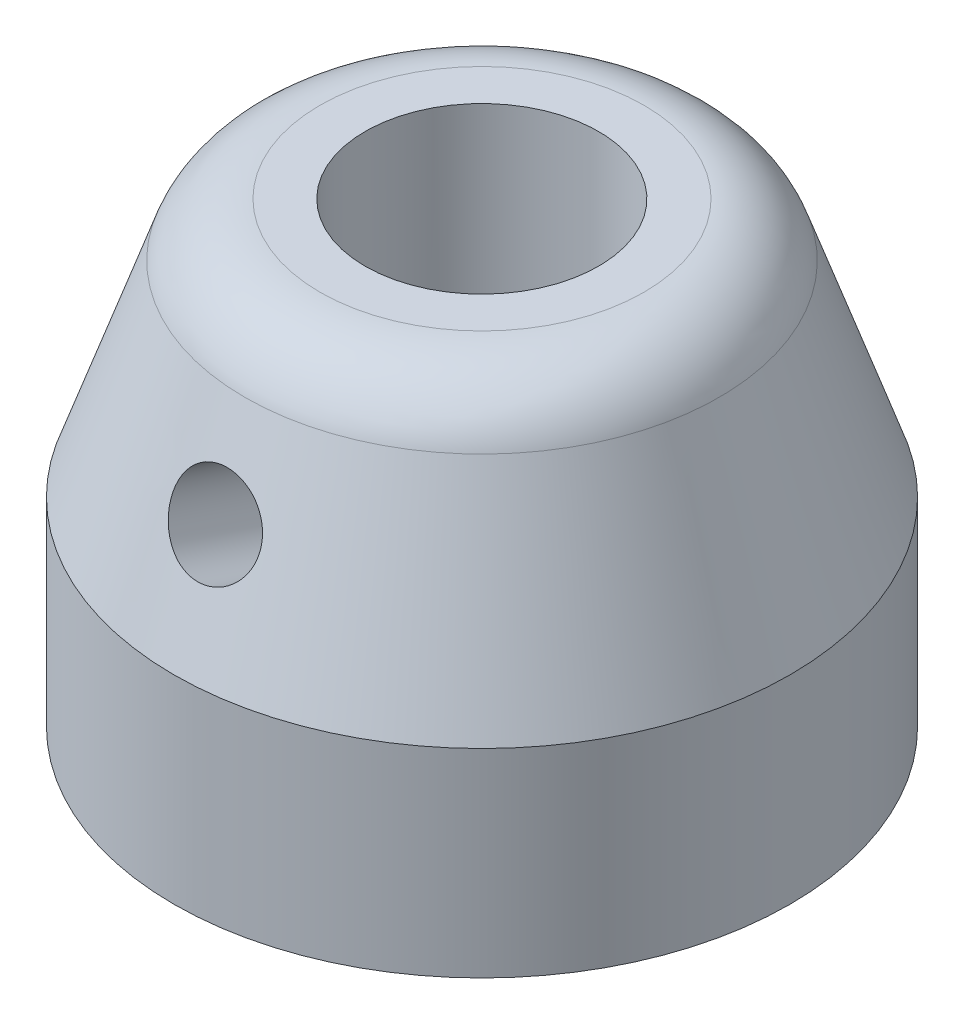
ISO-10303-21;
HEADER;
FILE_DESCRIPTION(('STEP AP214'),'2;1');
FILE_NAME('part.step','',(''),(''),'','','');
FILE_SCHEMA(('AUTOMOTIVE_DESIGN { 1 0 10303 214 1 1 1 1 }'));
ENDSEC;
DATA;
#1=APPLICATION_CONTEXT('core data for automotive mechanical design processes');
#2=APPLICATION_PROTOCOL_DEFINITION('international standard','automotive_design',2000,#1);
#3=PRODUCT_CONTEXT('',#1,'mechanical');
#4=PRODUCT('Part','Part','',(#3));
#5=PRODUCT_RELATED_PRODUCT_CATEGORY('part','',(#4));
#6=PRODUCT_DEFINITION_FORMATION('','',#4);
#7=PRODUCT_DEFINITION_CONTEXT('part definition',#1,'design');
#8=PRODUCT_DEFINITION('design','',#6,#7);
#9=PRODUCT_DEFINITION_SHAPE('','',#8);
#10=(LENGTH_UNIT() NAMED_UNIT(*) SI_UNIT(.MILLI.,.METRE.));
#11=(NAMED_UNIT(*) PLANE_ANGLE_UNIT() SI_UNIT($,.RADIAN.));
#12=(NAMED_UNIT(*) SI_UNIT($,.STERADIAN.) SOLID_ANGLE_UNIT());
#13=UNCERTAINTY_MEASURE_WITH_UNIT(LENGTH_MEASURE(1.E-05),#10,'distance_accuracy_value','');
#14=(GEOMETRIC_REPRESENTATION_CONTEXT(3) GLOBAL_UNCERTAINTY_ASSIGNED_CONTEXT((#13)) GLOBAL_UNIT_ASSIGNED_CONTEXT((#10,
#11,#12)) REPRESENTATION_CONTEXT('',''));
#15=CARTESIAN_POINT('',(0.,0.,0.));
#16=DIRECTION('',(0.,0.,1.));
#17=DIRECTION('',(1.,0.,0.));
#18=AXIS2_PLACEMENT_3D('',#15,#16,#17);
#19=CARTESIAN_POINT('',(0.000913764013984629,46.,0.0159483627720887));
#20=DIRECTION('',(0.,1.,0.));
#21=DIRECTION('',(0.,0.,1.));
#22=AXIS2_PLACEMENT_3D('',#19,#20,#21);
#23=CYLINDRICAL_SURFACE('',#22,11.75);
#24=CARTESIAN_POINT('',(0.000913764013984629,46.,0.0159483627720887));
#25=DIRECTION('',(0.,1.,0.));
#26=DIRECTION('',(0.,0.,1.));
#27=AXIS2_PLACEMENT_3D('',#24,#25,#26);
#28=CIRCLE('',#27,11.75);
#29=CARTESIAN_POINT('',(0.000913764013984629,46.,11.7659483627721));
#30=VERTEX_POINT('',#29);
#31=EDGE_CURVE('E74',#30,#30,#28,.T.);
#32=ORIENTED_EDGE('',*,*,#31,.T.);
#33=EDGE_LOOP('',(#32));
#34=FACE_BOUND('',#33,.T.);
#35=CARTESIAN_POINT('',(0.000913764013984629,2.,0.0159483627720887));
#36=DIRECTION('',(0.,-1.,0.));
#37=DIRECTION('',(0.,0.,-1.));
#38=AXIS2_PLACEMENT_3D('',#35,#36,#37);
#39=CIRCLE('',#38,11.75);
#40=CARTESIAN_POINT('',(0.000913764013984629,2.,-11.7340516372279));
#41=VERTEX_POINT('',#40);
#42=EDGE_CURVE('E54',#41,#41,#39,.F.);
#43=ORIENTED_EDGE('',*,*,#42,.F.);
#44=EDGE_LOOP('',(#43));
#45=FACE_BOUND('',#44,.T.);
#46=ADVANCED_FACE('F51',(#34,#45),#23,.F.);
#47=CARTESIAN_POINT('',(22.,46.,0.));
#48=DIRECTION('',(0.,-1.,0.));
#49=DIRECTION('',(0.,0.,-1.));
#50=AXIS2_PLACEMENT_3D('',#47,#48,#49);
#51=PLANE('',#50);
#52=CARTESIAN_POINT('',(0.,46.,0.));
#53=DIRECTION('',(0.,-1.,0.));
#54=DIRECTION('',(0.,0.,-1.));
#55=AXIS2_PLACEMENT_3D('',#52,#53,#54);
#56=CIRCLE('',#55,16.303497543263);
#57=CARTESIAN_POINT('',(0.,46.,-16.303497543263));
#58=VERTEX_POINT('',#57);
#59=EDGE_CURVE('E91',#58,#58,#56,.F.);
#60=ORIENTED_EDGE('',*,*,#59,.T.);
#61=EDGE_LOOP('',(#60));
#62=FACE_BOUND('',#61,.T.);
#63=ORIENTED_EDGE('',*,*,#31,.F.);
#64=EDGE_LOOP('',(#63));
#65=FACE_BOUND('',#64,.T.);
#66=ADVANCED_FACE('F114',(#62,#65),#51,.F.);
#67=CARTESIAN_POINT('',(0.,0.,0.));
#68=DIRECTION('',(0.,1.,0.));
#69=DIRECTION('',(0.,0.,1.));
#70=AXIS2_PLACEMENT_3D('',#67,#68,#69);
#71=PLANE('',#70);
#72=CARTESIAN_POINT('',(0.,0.,0.));
#73=DIRECTION('',(0.,-1.,0.));
#74=DIRECTION('',(0.,0.,-1.));
#75=AXIS2_PLACEMENT_3D('',#72,#73,#74);
#76=CIRCLE('',#75,18.2033523408867);
#77=CARTESIAN_POINT('',(0.,0.,18.2033523408867));
#78=VERTEX_POINT('',#77);
#79=EDGE_CURVE('E140',#78,#78,#76,.T.);
#80=ORIENTED_EDGE('',*,*,#79,.F.);
#81=EDGE_LOOP('',(#80));
#82=FACE_BOUND('',#81,.T.);
#83=CARTESIAN_POINT('',(0.,0.,0.));
#84=DIRECTION('',(0.,1.,0.));
#85=DIRECTION('',(0.,0.,1.));
#86=AXIS2_PLACEMENT_3D('',#83,#84,#85);
#87=CIRCLE('',#86,31.);
#88=CARTESIAN_POINT('',(0.,0.,31.));
#89=VERTEX_POINT('',#88);
#90=EDGE_CURVE('E90',#89,#89,#87,.T.);
#91=ORIENTED_EDGE('',*,*,#90,.F.);
#92=EDGE_LOOP('',(#91));
#93=FACE_BOUND('',#92,.T.);
#94=ADVANCED_FACE('F118',(#82,#93),#71,.F.);
#95=CARTESIAN_POINT('',(0.,46.,0.));
#96=DIRECTION('',(0.,1.,0.));
#97=DIRECTION('',(0.,0.,1.));
#98=AXIS2_PLACEMENT_3D('',#95,#96,#97);
#99=CYLINDRICAL_SURFACE('',#98,31.);
#100=CARTESIAN_POINT('',(0.,20.,0.));
#101=DIRECTION('',(0.,1.,0.));
#102=DIRECTION('',(0.,0.,1.));
#103=AXIS2_PLACEMENT_3D('',#100,#101,#102);
#104=CIRCLE('',#103,31.);
#105=CARTESIAN_POINT('',(0.,20.,31.));
#106=VERTEX_POINT('',#105);
#107=EDGE_CURVE('E78',#106,#106,#104,.T.);
#108=ORIENTED_EDGE('',*,*,#107,.F.);
#109=EDGE_LOOP('',(#108));
#110=FACE_BOUND('',#109,.T.);
#111=ORIENTED_EDGE('',*,*,#90,.T.);
#112=EDGE_LOOP('',(#111));
#113=FACE_BOUND('',#112,.T.);
#114=ADVANCED_FACE('F141',(#110,#113),#99,.T.);
#115=CARTESIAN_POINT('',(0.,20.,0.));
#116=DIRECTION('',(0.,-1.,0.));
#117=DIRECTION('',(0.,0.,-1.));
#118=AXIS2_PLACEMENT_3D('',#115,#116,#117);
#119=CONICAL_SURFACE('',#118,31.,0.333244301111673);
#120=CARTESIAN_POINT('',(-2.46260693911556,27.5747618757833,28.2709140382285));
#121=CARTESIAN_POINT('',(-2.67471313879416,27.700064366315,28.2088981514728));
#122=CARTESIAN_POINT('',(-2.8751199077155,27.8418948550959,28.139653644654));
#123=CARTESIAN_POINT('',(-3.24682694839401,28.155088235638,27.990062379626));
#124=CARTESIAN_POINT('',(-3.4180970015078,28.3264814213967,27.9097042497804));
#125=CARTESIAN_POINT('',(-3.72654761481929,28.6944417214186,27.741689719676));
#126=CARTESIAN_POINT('',(-3.86373834693527,28.8910012974659,27.6540355075891));
#127=CARTESIAN_POINT('',(-4.10012357196919,29.3043181836931,27.4753341055506));
#128=CARTESIAN_POINT('',(-4.19932748188148,29.5210704714803,27.3842877626627));
#129=CARTESIAN_POINT('',(-4.35658939534579,29.968392380982,27.2029071214093));
#130=CARTESIAN_POINT('',(-4.41478192090338,30.1989141125222,27.112571465285));
#131=CARTESIAN_POINT('',(-4.48875790743902,30.6681113095542,26.9357835107167));
#132=CARTESIAN_POINT('',(-4.50454315351322,30.9067864314081,26.8493310489639));
#133=CARTESIAN_POINT('',(-4.49326402326904,31.3828950296487,26.6841084748828));
#134=CARTESIAN_POINT('',(-4.46665801748936,31.6203143119496,26.6052658280715));
#135=CARTESIAN_POINT('',(-4.37225783692611,32.0896264064344,26.4562976625441));
#136=CARTESIAN_POINT('',(-4.30446402777988,32.3215192676592,26.3861720664506));
#137=CARTESIAN_POINT('',(-4.12982781060827,32.772718411518,26.2559739203233));
#138=CARTESIAN_POINT('',(-4.0230353740883,32.9920403878019,26.19588864794));
#139=CARTESIAN_POINT('',(-3.7734636081791,33.412018955146,26.0861187411154));
#140=CARTESIAN_POINT('',(-3.63068169787145,33.612674206143,26.0364348530582));
#141=CARTESIAN_POINT('',(-3.31137390327955,33.9914268328633,25.9468126045675));
#142=CARTESIAN_POINT('',(-3.13450160066254,34.1692583735251,25.9069848103832));
#143=CARTESIAN_POINT('',(-2.75289531122723,34.4943397417704,25.8371463270958));
#144=CARTESIAN_POINT('',(-2.54816014879518,34.641588278307,25.807136052404));
#145=CARTESIAN_POINT('',(-2.115164419278,34.9015547291696,25.755947118353));
#146=CARTESIAN_POINT('',(-1.88677389596488,35.01406673348,25.7348208638967));
#147=CARTESIAN_POINT('',(-1.41389232954915,35.199560443427,25.700821490246));
#148=CARTESIAN_POINT('',(-1.16940242896433,35.2725449508113,25.6879477860909));
#149=CARTESIAN_POINT('',(-0.673635307918935,35.3759199013376,25.6699091230474));
#150=CARTESIAN_POINT('',(-0.422440558884937,35.4066935964754,25.6646747745649));
#151=CARTESIAN_POINT('',(0.0815952279693506,35.4257774696568,25.6614150523405));
#152=CARTESIAN_POINT('',(0.334436163147,35.4140902703759,25.6633892333506));
#153=CARTESIAN_POINT('',(0.832068477561531,35.3489961718621,25.6745991400029));
#154=CARTESIAN_POINT('',(1.0769134141751,35.295985445984,25.683765914866));
#155=CARTESIAN_POINT('',(1.55418468328266,35.1505804371211,25.7097325379822));
#156=CARTESIAN_POINT('',(1.78661051203543,35.0581845579667,25.7265326955967));
#157=CARTESIAN_POINT('',(2.23394504066277,34.83647265403,25.7685999346819));
#158=CARTESIAN_POINT('',(2.44874677282514,34.7069499539074,25.7939145546905));
#159=CARTESIAN_POINT('',(2.85354577840605,34.4153649422243,25.8538238887858));
#160=CARTESIAN_POINT('',(3.04354114409894,34.2533001304528,25.8884193159859));
#161=CARTESIAN_POINT('',(3.39562901242977,33.89957423256,25.9680993309045));
#162=CARTESIAN_POINT('',(3.55737219531522,33.7075915725182,26.0133009619365));
#163=CARTESIAN_POINT('',(3.84566752768857,33.3013099227777,26.1144080227888));
#164=CARTESIAN_POINT('',(3.97222006536443,33.0870111792835,26.1703133345254));
#165=CARTESIAN_POINT('',(4.1863374358716,32.6428047903131,26.2926294149973));
#166=CARTESIAN_POINT('',(4.273943587397,32.4129139866211,26.3590289483861));
#167=CARTESIAN_POINT('',(4.40770820599501,31.9442368697026,26.5014690046821));
#168=CARTESIAN_POINT('',(4.453869947519,31.705451260792,26.5775087653898));
#169=CARTESIAN_POINT('',(4.50304708252596,31.2288209614074,26.7365460278539));
#170=CARTESIAN_POINT('',(4.50654773870063,30.9909965122057,26.8194544544453));
#171=CARTESIAN_POINT('',(4.47156672480509,30.5203591055777,26.9904550090351));
#172=CARTESIAN_POINT('',(4.43308575443905,30.2875460646927,27.0785470506154));
#173=CARTESIAN_POINT('',(4.31550938572783,29.8340253732151,27.2564855664813));
#174=CARTESIAN_POINT('',(4.23654161671231,29.6132820799327,27.346325679072));
#175=CARTESIAN_POINT('',(4.04037462809405,29.1888338181478,27.5245006592055));
#176=CARTESIAN_POINT('',(3.92317311106357,28.9851298744471,27.6128354359585));
#177=CARTESIAN_POINT('',(3.6525557664653,28.5980022407025,27.7851004721415));
#178=CARTESIAN_POINT('',(3.498807758568,28.4147886895107,27.8689811450507));
#179=CARTESIAN_POINT('',(3.15997532538909,28.0753877144621,28.0276586185955));
#180=CARTESIAN_POINT('',(2.97488932254718,27.9192016519749,28.1024549615986));
#181=CARTESIAN_POINT('',(2.57697256340036,27.6366303508456,28.2399604168169));
#182=CARTESIAN_POINT('',(2.3639463102328,27.5104746033418,28.3025758182732));
#183=CARTESIAN_POINT('',(1.91718805982549,27.2926594688135,28.4119096342992));
#184=CARTESIAN_POINT('',(1.68345734678564,27.2009979441234,28.458629033954));
#185=CARTESIAN_POINT('',(1.20315007594064,27.0549112315702,28.5335778925606));
#186=CARTESIAN_POINT('',(0.956645143294292,27.0002984461995,28.5619004729027));
#187=CARTESIAN_POINT('',(0.456724574508723,26.9290017931295,28.5989477242252));
#188=CARTESIAN_POINT('',(0.203308064584291,26.9123227438473,28.607669905523));
#189=CARTESIAN_POINT('',(-0.300733565325077,26.9173225969799,28.6050622564529));
#190=CARTESIAN_POINT('',(-0.551363287712436,26.9386577714617,28.5939121131327));
#191=CARTESIAN_POINT('',(-1.04484420914491,27.0184558930623,28.5524911062392));
#192=CARTESIAN_POINT('',(-1.28770246371461,27.0768840983569,28.5222381347703));
#193=CARTESIAN_POINT('',(-1.68834746573237,27.2064212013683,28.4559150333033));
#194=CARTESIAN_POINT('',(-1.84986370974509,27.2685189012979,28.4242869370323));
#195=CARTESIAN_POINT('',(-2.16365395981802,27.4093636102759,28.3532295654693));
#196=CARTESIAN_POINT('',(-2.31592791059174,27.4881107189068,28.313800243517));
#197=CARTESIAN_POINT('',(-2.46260693911556,27.5747618757833,28.2709140382285));
#198=B_SPLINE_CURVE_WITH_KNOTS('',3,(#120,#121,#122,#123,#124,#125,#126,#127,#128,#129,#130,
#131,#132,#133,#134,#135,#136,#137,#138,#139,#140,#141,#142,#143,#144,#145,#146,#147,#148,#149,
#150,#151,#152,#153,#154,#155,#156,#157,#158,#159,#160,#161,#162,#163,#164,#165,#166,#167,#168,
#169,#170,#171,#172,#173,#174,#175,#176,#177,#178,#179,#180,#181,#182,#183,#184,#185,#186,#187,
#188,#189,#190,#191,#192,#193,#194,#195,#196,#197),.UNSPECIFIED.,.T.,.F.,(4,2,2,2,2,2,2,2,2,2,2,
2,2,2,2,2,2,2,2,2,2,2,2,2,2,2,2,2,2,2,2,2,2,2,2,2,2,2,4),(0.,0.761478533373101,1.52374206908933,
2.28577781199907,3.04762452253207,3.80696050970644,4.56626453281679,5.31741387391342,
6.06855654691372,6.81874008940666,7.56897744523578,8.32728403137302,9.08562262255964,
9.84837378467346,10.6110708751584,11.3667961869343,12.1224748207381,12.8709964629822,
13.61954844359,14.3723511524081,15.1252117212189,15.8868073544659,16.6483945862189,
17.4091719013244,18.169889103435,18.921945089821,19.6739885419459,20.4236757202706,
21.1734079548495,21.9302344537693,22.6870990628048,23.4495741867771,24.2120020510865,
24.9705399306456,25.7291741557853,26.4809835160322,27.2320897584457,27.7586762685043,
28.2852659282415),.UNSPECIFIED.);
#199=CARTESIAN_POINT('',(-2.46260693911556,27.5747618757833,28.2709140382285));
#200=VERTEX_POINT('',#199);
#201=EDGE_CURVE('E11',#200,#200,#198,.T.);
#202=ORIENTED_EDGE('',*,*,#201,.T.);
#203=EDGE_LOOP('',(#202));
#204=FACE_BOUND('',#203,.T.);
#205=CARTESIAN_POINT('',(0.,40.6168845110653,0.));
#206=DIRECTION('',(0.,1.,0.));
#207=DIRECTION('',(0.,0.,1.));
#208=AXIS2_PLACEMENT_3D('',#205,#206,#207);
#209=CIRCLE('',#208,23.8633861307851);
#210=CARTESIAN_POINT('',(0.,40.6168845110653,23.8633861307851));
#211=VERTEX_POINT('',#210);
#212=EDGE_CURVE('E58',#211,#211,#209,.F.);
#213=ORIENTED_EDGE('',*,*,#212,.T.);
#214=EDGE_LOOP('',(#213));
#215=FACE_BOUND('',#214,.T.);
#216=ORIENTED_EDGE('',*,*,#107,.T.);
#217=EDGE_LOOP('',(#216));
#218=FACE_BOUND('',#217,.T.);
#219=ADVANCED_FACE('F102',(#204,#215,#218),#119,.T.);
#220=CARTESIAN_POINT('',(0.,38.,0.));
#221=DIRECTION('',(0.,-1.,0.));
#222=DIRECTION('',(0.,0.,-1.));
#223=AXIS2_PLACEMENT_3D('',#220,#221,#222);
#224=TOROIDAL_SURFACE('',#223,16.303497543263,8.);
#225=ORIENTED_EDGE('',*,*,#212,.F.);
#226=EDGE_LOOP('',(#225));
#227=FACE_BOUND('',#226,.T.);
#228=ORIENTED_EDGE('',*,*,#59,.F.);
#229=EDGE_LOOP('',(#228));
#230=FACE_BOUND('',#229,.T.);
#231=ADVANCED_FACE('F52',(#227,#230),#224,.T.);
#232=CARTESIAN_POINT('',(0.,31.1670237766628,27.1344917696168));
#233=DIRECTION('',(0.,0.327110563883166,0.944986073440258));
#234=DIRECTION('',(0.,-0.944986073440258,0.327110563883166));
#235=AXIS2_PLACEMENT_3D('',#232,#233,#234);
#236=CYLINDRICAL_SURFACE('',#235,4.49999999999999);
#237=CARTESIAN_POINT('',(0.,27.8959181378311,17.6846310352142));
#238=DIRECTION('',(0.,0.327110563883166,0.944986073440258));
#239=DIRECTION('',(0.,-0.944986073440258,0.327110563883166));
#240=AXIS2_PLACEMENT_3D('',#237,#238,#239);
#241=CIRCLE('',#240,4.5);
#242=CARTESIAN_POINT('',(0.,23.6434808073499,19.1566285726884));
#243=VERTEX_POINT('',#242);
#244=EDGE_CURVE('E72',#243,#243,#241,.T.);
#245=ORIENTED_EDGE('',*,*,#244,.F.);
#246=EDGE_LOOP('',(#245));
#247=FACE_BOUND('',#246,.T.);
#248=ORIENTED_EDGE('',*,*,#201,.F.);
#249=EDGE_LOOP('',(#248));
#250=FACE_BOUND('',#249,.T.);
#251=ADVANCED_FACE('F70',(#247,#250),#236,.F.);
#252=CARTESIAN_POINT('',(0.,27.8959181378311,17.6846310352142));
#253=DIRECTION('',(0.,0.327110563883166,0.944986073440258));
#254=DIRECTION('',(0.,-0.944986073440258,0.327110563883166));
#255=AXIS2_PLACEMENT_3D('',#252,#253,#254);
#256=CONICAL_SURFACE('',#255,4.5,1.02974425867665);
#257=CARTESIAN_POINT('',(0.,27.0114527862573,15.1295089084454));
#258=VERTEX_POINT('',#257);
#259=VERTEX_LOOP('',#258);
#260=FACE_BOUND('',#259,.T.);
#261=ORIENTED_EDGE('',*,*,#244,.T.);
#262=EDGE_LOOP('',(#261));
#263=FACE_BOUND('',#262,.T.);
#264=ADVANCED_FACE('F65',(#260,#263),#256,.F.);
#265=CARTESIAN_POINT('',(0.,2.,0.));
#266=DIRECTION('',(0.,-1.,0.));
#267=DIRECTION('',(0.,0.,-1.));
#268=AXIS2_PLACEMENT_3D('',#265,#266,#267);
#269=PLANE('',#268);
#270=CARTESIAN_POINT('',(0.,2.,0.));
#271=DIRECTION('',(0.,-1.,0.));
#272=DIRECTION('',(0.,0.,-1.));
#273=AXIS2_PLACEMENT_3D('',#270,#271,#272);
#274=CIRCLE('',#273,12.5);
#275=CARTESIAN_POINT('',(0.,2.,12.5));
#276=VERTEX_POINT('',#275);
#277=EDGE_CURVE('E85',#276,#276,#274,.T.);
#278=ORIENTED_EDGE('',*,*,#277,.T.);
#279=EDGE_LOOP('',(#278));
#280=FACE_BOUND('',#279,.T.);
#281=ORIENTED_EDGE('',*,*,#42,.T.);
#282=EDGE_LOOP('',(#281));
#283=FACE_BOUND('',#282,.T.);
#284=ADVANCED_FACE('F67',(#280,#283),#269,.T.);
#285=CARTESIAN_POINT('',(0.,-42.7780091116164,0.));
#286=DIRECTION('',(0.,-1.,0.));
#287=DIRECTION('',(0.,0.,1.));
#288=AXIS2_PLACEMENT_3D('',#285,#286,#287);
#289=SPHERICAL_SURFACE('',#288,46.49);
#290=CARTESIAN_POINT('',(0.,0.,18.2033523408867));
#291=CARTESIAN_POINT('',(0.,0.0246684133572685,18.145381393763));
#292=CARTESIAN_POINT('',(0.,0.0492189856771059,18.0873603016764));
#293=CARTESIAN_POINT('',(0.,0.0980840455462954,17.9712187878479));
#294=CARTESIAN_POINT('',(0.,0.122398533095648,17.9130983661059));
#295=CARTESIAN_POINT('',(0.,0.170791020728241,17.7967591532368));
#296=CARTESIAN_POINT('',(0.,0.194869020811483,17.7385403621096));
#297=CARTESIAN_POINT('',(0.,0.242788135770466,17.6220053728059));
#298=CARTESIAN_POINT('',(0.,0.266629250646208,17.5636891746294));
#299=CARTESIAN_POINT('',(0.,0.314074201083891,17.4469603350552));
#300=CARTESIAN_POINT('',(0.,0.337678036645833,17.3885476936575));
#301=CARTESIAN_POINT('',(0.,0.384648038346454,17.2716269330944));
#302=CARTESIAN_POINT('',(0.,0.408014204485133,17.213118813929));
#303=CARTESIAN_POINT('',(0.,0.454508481137847,17.0960080648539));
#304=CARTESIAN_POINT('',(0.,0.477636591651881,17.0374054349441));
#305=CARTESIAN_POINT('',(0.,0.523654374793932,16.9201066329678));
#306=CARTESIAN_POINT('',(0.,0.546544047421947,16.8614104609012));
#307=CARTESIAN_POINT('',(0.,0.592084576470035,16.7439255447442));
#308=CARTESIAN_POINT('',(0.,0.614735432890108,16.6851368006538));
#309=CARTESIAN_POINT('',(0.,0.659797955147947,16.5674677121124));
#310=CARTESIAN_POINT('',(0.,0.682209620985715,16.5085873676614));
#311=CARTESIAN_POINT('',(0.,0.72679339165783,16.390736051576));
#312=CARTESIAN_POINT('',(0.,0.748965496492178,16.3317650799416));
#313=CARTESIAN_POINT('',(0.,0.793069778695842,16.2137334841645));
#314=CARTESIAN_POINT('',(0.,0.815001956065158,16.1546728600217));
#315=CARTESIAN_POINT('',(0.,0.858626020842672,16.0364629353847));
#316=CARTESIAN_POINT('',(0.,0.88031790825087,15.9773136348905));
#317=CARTESIAN_POINT('',(0.,0.923461034581588,15.8589273351729));
#318=CARTESIAN_POINT('',(0.,0.944912273504109,15.7996903359496));
#319=CARTESIAN_POINT('',(0.,0.987573748316364,15.681129617846));
#320=CARTESIAN_POINT('',(0.,1.0087839842061,15.6218058989657));
#321=CARTESIAN_POINT('',(0.,1.05096310238898,15.5030727220533));
#322=CARTESIAN_POINT('',(0.,1.07193198468213,15.4436632640212));
#323=CARTESIAN_POINT('',(0.,1.11362804909713,15.3247595907277));
#324=CARTESIAN_POINT('',(0.,1.134355231219,15.2652653754662));
#325=CARTESIAN_POINT('',(0.,1.17556755271157,15.1461931710372));
#326=CARTESIAN_POINT('',(0.,1.19605269208228,15.0866151818696));
#327=CARTESIAN_POINT('',(0.,1.23678058949318,14.9673764143362));
#328=CARTESIAN_POINT('',(0.,1.25702334753338,14.9077156359703));
#329=CARTESIAN_POINT('',(0.,1.29726614770996,14.7883122761167));
#330=CARTESIAN_POINT('',(0.,1.31726618984635,14.7285696946288));
#331=CARTESIAN_POINT('',(0.,1.35702322765367,14.6090037159593));
#332=CARTESIAN_POINT('',(0.,1.3767802233246,14.5491803187777));
#333=CARTESIAN_POINT('',(0.,1.41605084165642,14.4294536974847));
#334=CARTESIAN_POINT('',(0.,1.43556446431732,14.3695504733734));
#335=CARTESIAN_POINT('',(0.,1.47434801410697,14.2496651883042));
#336=CARTESIAN_POINT('',(0.,1.49361794123573,14.1896831273464));
#337=CARTESIAN_POINT('',(0.,1.53191378146685,14.0696411599709));
#338=CARTESIAN_POINT('',(0.,1.55093969456921,14.0095812535531));
#339=CARTESIAN_POINT('',(0.,1.58874719228623,13.8893845879306));
#340=CARTESIAN_POINT('',(0.,1.60752877690089,13.8292478287258));
#341=CARTESIAN_POINT('',(0.,1.64484730721992,13.7088984514726));
#342=CARTESIAN_POINT('',(0.,1.66338425292428,13.6486858334242));
#343=CARTESIAN_POINT('',(0.,1.70021319904196,13.5281857336805));
#344=CARTESIAN_POINT('',(0.,1.71850519945529,13.4678982519851));
#345=CARTESIAN_POINT('',(0.,1.75484395266429,13.3472494213831));
#346=CARTESIAN_POINT('',(0.,1.77289070545996,13.2868880724765));
#347=CARTESIAN_POINT('',(0.,1.80873866513949,13.1660925051026));
#348=CARTESIAN_POINT('',(0.,1.82653987202335,13.1056582866353));
#349=CARTESIAN_POINT('',(0.,1.86189644572183,12.9847179790172));
#350=CARTESIAN_POINT('',(0.,1.87945181253647,12.9242118898664));
#351=CARTESIAN_POINT('',(0.,1.91431641570994,12.8031288408634));
#352=CARTESIAN_POINT('',(0.,1.93162565206878,12.7425518810113));
#353=CARTESIAN_POINT('',(0.,1.96599770910345,12.6213280920687));
#354=CARTESIAN_POINT('',(0.,1.98306052977928,12.5606812629782));
#355=CARTESIAN_POINT('',(0.,2.,12.5));
#356=B_SPLINE_CURVE_WITH_KNOTS('',3,(#290,#291,#292,#293,#294,#295,#296,#297,#298,#299,#300,
#301,#302,#303,#304,#305,#306,#307,#308,#309,#310,#311,#312,#313,#314,#315,#316,#317,#318,#319,
#320,#321,#322,#323,#324,#325,#326,#327,#328,#329,#330,#331,#332,#333,#334,#335,#336,#337,#338,
#339,#340,#341,#342,#343,#344,#345,#346,#347,#348,#349,#350,#351,#352,#353,#354,#355),
.UNSPECIFIED.,.F.,.F.,(4,2,2,2,2,2,2,2,2,2,2,2,2,2,2,2,2,2,2,2,2,2,2,2,2,2,2,2,2,2,2,2,4),(0.,
0.189003710933403,0.378007421866815,0.567011132800226,0.756014843733629,0.945018554667031,
1.13402226560044,1.32302597653385,1.51202968746725,1.70103339840066,1.89003710933407,
2.07904082026748,2.26804453120088,2.45704824213429,2.6460519530677,2.83505566400111,
3.02405937493451,3.21306308586792,3.40206679680133,3.59107050773474,3.78007421866814,
3.96907792960154,4.15808164053495,4.34708535146837,4.53608906240177,4.72509277333517,
4.91409648426858,5.10310019520199,5.2921039061354,5.4811076170688,5.67011132800221,
5.85911503893562,6.04811874986903),.UNSPECIFIED.);
#357=EDGE_CURVE('BSEAM127',#78,#276,#356,.T.);
#358=ORIENTED_EDGE('',*,*,#79,.T.);
#359=ORIENTED_EDGE('',*,*,#277,.F.);
#360=ORIENTED_EDGE('',*,*,#357,.T.);
#361=ORIENTED_EDGE('',*,*,#357,.F.);
#362=EDGE_LOOP('',(#358,#360,#359,#361));
#363=FACE_BOUND('',#362,.T.);
#364=ADVANCED_FACE('F127',(#363),#289,.F.);
#365=CLOSED_SHELL('',(#46,#66,#94,#114,#219,#231,#251,#264,#284,#364));
#366=MANIFOLD_SOLID_BREP('B2',#365);
#367=ADVANCED_BREP_SHAPE_REPRESENTATION('',(#18,#366),#14);
#368=SHAPE_DEFINITION_REPRESENTATION(#9,#367);
ENDSEC;
END-ISO-10303-21;
